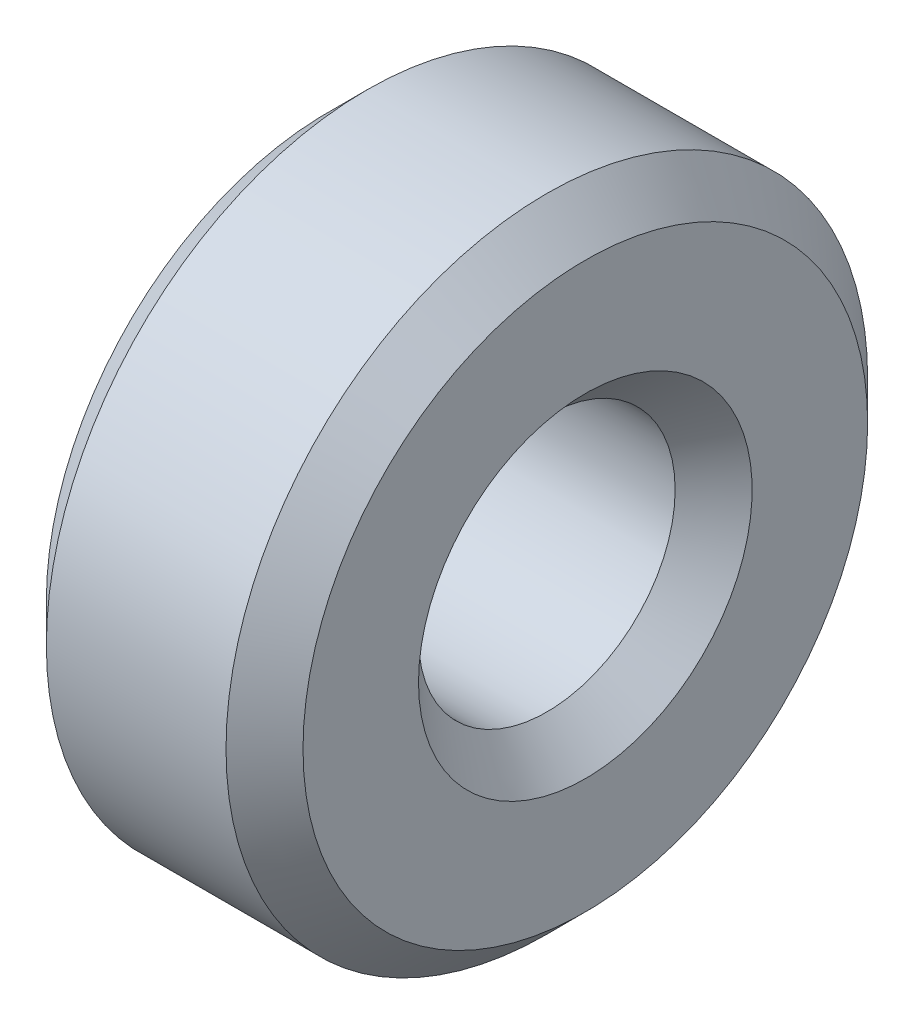
ISO-10303-21;
HEADER;
FILE_DESCRIPTION(('STEP AP214'),'2;1');
FILE_NAME('part.step','',(''),(''),'','','');
FILE_SCHEMA(('AUTOMOTIVE_DESIGN { 1 0 10303 214 1 1 1 1 }'));
ENDSEC;
DATA;
#1=APPLICATION_CONTEXT('core data for automotive mechanical design processes');
#2=APPLICATION_PROTOCOL_DEFINITION('international standard','automotive_design',2000,#1);
#3=PRODUCT_CONTEXT('',#1,'mechanical');
#4=PRODUCT('Part','Part','',(#3));
#5=PRODUCT_RELATED_PRODUCT_CATEGORY('part','',(#4));
#6=PRODUCT_DEFINITION_FORMATION('','',#4);
#7=PRODUCT_DEFINITION_CONTEXT('part definition',#1,'design');
#8=PRODUCT_DEFINITION('design','',#6,#7);
#9=PRODUCT_DEFINITION_SHAPE('','',#8);
#10=(LENGTH_UNIT() NAMED_UNIT(*) SI_UNIT(.MILLI.,.METRE.));
#11=(NAMED_UNIT(*) PLANE_ANGLE_UNIT() SI_UNIT($,.RADIAN.));
#12=(NAMED_UNIT(*) SI_UNIT($,.STERADIAN.) SOLID_ANGLE_UNIT());
#13=UNCERTAINTY_MEASURE_WITH_UNIT(LENGTH_MEASURE(1.E-05),#10,'distance_accuracy_value','');
#14=(GEOMETRIC_REPRESENTATION_CONTEXT(3) GLOBAL_UNCERTAINTY_ASSIGNED_CONTEXT((#13)) GLOBAL_UNIT_ASSIGNED_CONTEXT((#10,
#11,#12)) REPRESENTATION_CONTEXT('',''));
#15=CARTESIAN_POINT('',(0.,0.,0.));
#16=DIRECTION('',(0.,0.,1.));
#17=DIRECTION('',(1.,0.,0.));
#18=AXIS2_PLACEMENT_3D('',#15,#16,#17);
#19=CARTESIAN_POINT('',(0.,0.,0.));
#20=DIRECTION('',(-1.,0.,0.));
#21=DIRECTION('',(0.,0.,1.));
#22=AXIS2_PLACEMENT_3D('',#19,#20,#21);
#23=CYLINDRICAL_SURFACE('',#22,2.5);
#24=CARTESIAN_POINT('',(0.3,0.,0.));
#25=DIRECTION('',(1.,0.,0.));
#26=DIRECTION('',(0.,0.,-1.));
#27=AXIS2_PLACEMENT_3D('',#24,#25,#26);
#28=CIRCLE('',#27,2.5);
#29=CARTESIAN_POINT('',(0.3,0.,-2.5));
#30=VERTEX_POINT('',#29);
#31=EDGE_CURVE('E37',#30,#30,#28,.T.);
#32=ORIENTED_EDGE('',*,*,#31,.T.);
#33=EDGE_LOOP('',(#32));
#34=FACE_BOUND('',#33,.T.);
#35=CARTESIAN_POINT('',(1.7,0.,0.));
#36=DIRECTION('',(-1.,0.,0.));
#37=DIRECTION('',(0.,0.,1.));
#38=AXIS2_PLACEMENT_3D('',#35,#36,#37);
#39=CIRCLE('',#38,2.5);
#40=CARTESIAN_POINT('',(1.7,0.,2.5));
#41=VERTEX_POINT('',#40);
#42=EDGE_CURVE('E41',#41,#41,#39,.T.);
#43=ORIENTED_EDGE('',*,*,#42,.T.);
#44=EDGE_LOOP('',(#43));
#45=FACE_BOUND('',#44,.T.);
#46=ADVANCED_FACE('F27',(#34,#45),#23,.T.);
#47=CARTESIAN_POINT('',(2.,2.5,0.));
#48=DIRECTION('',(-1.,0.,0.));
#49=DIRECTION('',(0.,0.,1.));
#50=AXIS2_PLACEMENT_3D('',#47,#48,#49);
#51=PLANE('',#50);
#52=CARTESIAN_POINT('',(2.,0.,0.));
#53=DIRECTION('',(-1.,0.,0.));
#54=DIRECTION('',(0.,0.,1.));
#55=AXIS2_PLACEMENT_3D('',#52,#53,#54);
#56=CIRCLE('',#55,1.3);
#57=CARTESIAN_POINT('',(2.,0.,1.3));
#58=VERTEX_POINT('',#57);
#59=EDGE_CURVE('E10',#58,#58,#56,.T.);
#60=ORIENTED_EDGE('',*,*,#59,.T.);
#61=EDGE_LOOP('',(#60));
#62=FACE_BOUND('',#61,.T.);
#63=CARTESIAN_POINT('',(2.,0.,0.));
#64=DIRECTION('',(-1.,0.,0.));
#65=DIRECTION('',(0.,0.,1.));
#66=AXIS2_PLACEMENT_3D('',#63,#64,#65);
#67=CIRCLE('',#66,2.2);
#68=CARTESIAN_POINT('',(2.,0.,2.2));
#69=VERTEX_POINT('',#68);
#70=EDGE_CURVE('E33',#69,#69,#67,.F.);
#71=ORIENTED_EDGE('',*,*,#70,.T.);
#72=EDGE_LOOP('',(#71));
#73=FACE_BOUND('',#72,.T.);
#74=ADVANCED_FACE('F77',(#62,#73),#51,.F.);
#75=CARTESIAN_POINT('',(0.,0.,0.));
#76=DIRECTION('',(-1.,0.,0.));
#77=DIRECTION('',(0.,0.,1.));
#78=AXIS2_PLACEMENT_3D('',#75,#76,#77);
#79=CYLINDRICAL_SURFACE('',#78,1.);
#80=CARTESIAN_POINT('',(0.299999999999998,0.,0.));
#81=DIRECTION('',(1.,0.,0.));
#82=DIRECTION('',(0.,0.,-1.));
#83=AXIS2_PLACEMENT_3D('',#80,#81,#82);
#84=CIRCLE('',#83,1.);
#85=CARTESIAN_POINT('',(0.299999999999998,0.,-1.));
#86=VERTEX_POINT('',#85);
#87=EDGE_CURVE('E52',#86,#86,#84,.F.);
#88=ORIENTED_EDGE('',*,*,#87,.T.);
#89=EDGE_LOOP('',(#88));
#90=FACE_BOUND('',#89,.T.);
#91=CARTESIAN_POINT('',(1.7,0.,0.));
#92=DIRECTION('',(-1.,0.,0.));
#93=DIRECTION('',(0.,0.,1.));
#94=AXIS2_PLACEMENT_3D('',#91,#92,#93);
#95=CIRCLE('',#94,1.);
#96=CARTESIAN_POINT('',(1.7,0.,1.));
#97=VERTEX_POINT('',#96);
#98=EDGE_CURVE('E55',#97,#97,#95,.F.);
#99=ORIENTED_EDGE('',*,*,#98,.T.);
#100=EDGE_LOOP('',(#99));
#101=FACE_BOUND('',#100,.T.);
#102=ADVANCED_FACE('F59',(#90,#101),#79,.F.);
#103=CARTESIAN_POINT('',(0.,1.,0.));
#104=DIRECTION('',(1.,0.,0.));
#105=DIRECTION('',(0.,0.,-1.));
#106=AXIS2_PLACEMENT_3D('',#103,#104,#105);
#107=PLANE('',#106);
#108=CARTESIAN_POINT('',(0.,0.,0.));
#109=DIRECTION('',(1.,0.,0.));
#110=DIRECTION('',(0.,0.,-1.));
#111=AXIS2_PLACEMENT_3D('',#108,#109,#110);
#112=CIRCLE('',#111,1.3);
#113=CARTESIAN_POINT('',(0.,0.,-1.3));
#114=VERTEX_POINT('',#113);
#115=EDGE_CURVE('E46',#114,#114,#112,.T.);
#116=ORIENTED_EDGE('',*,*,#115,.T.);
#117=EDGE_LOOP('',(#116));
#118=FACE_BOUND('',#117,.T.);
#119=CARTESIAN_POINT('',(0.,0.,0.));
#120=DIRECTION('',(1.,0.,0.));
#121=DIRECTION('',(0.,0.,-1.));
#122=AXIS2_PLACEMENT_3D('',#119,#120,#121);
#123=CIRCLE('',#122,2.2);
#124=CARTESIAN_POINT('',(0.,0.,-2.2));
#125=VERTEX_POINT('',#124);
#126=EDGE_CURVE('E49',#125,#125,#123,.F.);
#127=ORIENTED_EDGE('',*,*,#126,.T.);
#128=EDGE_LOOP('',(#127));
#129=FACE_BOUND('',#128,.T.);
#130=ADVANCED_FACE('F89',(#118,#129),#107,.F.);
#131=CARTESIAN_POINT('',(0.299999999999998,0.,0.));
#132=DIRECTION('',(-1.,0.,0.));
#133=DIRECTION('',(0.,0.,1.));
#134=AXIS2_PLACEMENT_3D('',#131,#132,#133);
#135=CONICAL_SURFACE('',#134,1.,0.78539816339745);
#136=ORIENTED_EDGE('',*,*,#115,.F.);
#137=EDGE_LOOP('',(#136));
#138=FACE_BOUND('',#137,.T.);
#139=ORIENTED_EDGE('',*,*,#87,.F.);
#140=EDGE_LOOP('',(#139));
#141=FACE_BOUND('',#140,.T.);
#142=ADVANCED_FACE('F73',(#138,#141),#135,.F.);
#143=CARTESIAN_POINT('',(0.,0.,0.));
#144=DIRECTION('',(1.,0.,0.));
#145=DIRECTION('',(0.,0.,-1.));
#146=AXIS2_PLACEMENT_3D('',#143,#144,#145);
#147=CONICAL_SURFACE('',#146,2.2,0.78539816339745);
#148=ORIENTED_EDGE('',*,*,#31,.F.);
#149=EDGE_LOOP('',(#148));
#150=FACE_BOUND('',#149,.T.);
#151=ORIENTED_EDGE('',*,*,#126,.F.);
#152=EDGE_LOOP('',(#151));
#153=FACE_BOUND('',#152,.T.);
#154=ADVANCED_FACE('F65',(#150,#153),#147,.T.);
#155=CARTESIAN_POINT('',(2.,0.,0.));
#156=DIRECTION('',(1.,0.,0.));
#157=DIRECTION('',(0.,0.,-1.));
#158=AXIS2_PLACEMENT_3D('',#155,#156,#157);
#159=CONICAL_SURFACE('',#158,1.3,0.785398163397446);
#160=ORIENTED_EDGE('',*,*,#98,.F.);
#161=EDGE_LOOP('',(#160));
#162=FACE_BOUND('',#161,.T.);
#163=ORIENTED_EDGE('',*,*,#59,.F.);
#164=EDGE_LOOP('',(#163));
#165=FACE_BOUND('',#164,.T.);
#166=ADVANCED_FACE('F61',(#162,#165),#159,.F.);
#167=CARTESIAN_POINT('',(1.7,0.,0.));
#168=DIRECTION('',(-1.,0.,0.));
#169=DIRECTION('',(0.,0.,1.));
#170=AXIS2_PLACEMENT_3D('',#167,#168,#169);
#171=CONICAL_SURFACE('',#170,2.5,0.785398163397447);
#172=CARTESIAN_POINT('',(2.,0.,2.2));
#173=CARTESIAN_POINT('',(1.996875,0.,2.203125));
#174=CARTESIAN_POINT('',(1.99375,0.,2.20625));
#175=CARTESIAN_POINT('',(1.9875,0.,2.2125));
#176=CARTESIAN_POINT('',(1.984375,0.,2.215625));
#177=CARTESIAN_POINT('',(1.978125,0.,2.221875));
#178=CARTESIAN_POINT('',(1.975,0.,2.225));
#179=CARTESIAN_POINT('',(1.96875,0.,2.23125));
#180=CARTESIAN_POINT('',(1.965625,0.,2.234375));
#181=CARTESIAN_POINT('',(1.959375,0.,2.240625));
#182=CARTESIAN_POINT('',(1.95625,0.,2.24375));
#183=CARTESIAN_POINT('',(1.95,0.,2.25));
#184=CARTESIAN_POINT('',(1.946875,0.,2.253125));
#185=CARTESIAN_POINT('',(1.940625,0.,2.259375));
#186=CARTESIAN_POINT('',(1.9375,0.,2.2625));
#187=CARTESIAN_POINT('',(1.93125,0.,2.26875));
#188=CARTESIAN_POINT('',(1.928125,0.,2.271875));
#189=CARTESIAN_POINT('',(1.921875,0.,2.278125));
#190=CARTESIAN_POINT('',(1.91875,0.,2.28125));
#191=CARTESIAN_POINT('',(1.9125,0.,2.2875));
#192=CARTESIAN_POINT('',(1.909375,0.,2.290625));
#193=CARTESIAN_POINT('',(1.903125,0.,2.296875));
#194=CARTESIAN_POINT('',(1.9,0.,2.3));
#195=CARTESIAN_POINT('',(1.89375,0.,2.30625));
#196=CARTESIAN_POINT('',(1.890625,0.,2.309375));
#197=CARTESIAN_POINT('',(1.884375,0.,2.315625));
#198=CARTESIAN_POINT('',(1.88125,0.,2.31875));
#199=CARTESIAN_POINT('',(1.875,0.,2.325));
#200=CARTESIAN_POINT('',(1.871875,0.,2.328125));
#201=CARTESIAN_POINT('',(1.865625,0.,2.334375));
#202=CARTESIAN_POINT('',(1.8625,0.,2.3375));
#203=CARTESIAN_POINT('',(1.85625,0.,2.34375));
#204=CARTESIAN_POINT('',(1.853125,0.,2.346875));
#205=CARTESIAN_POINT('',(1.846875,0.,2.353125));
#206=CARTESIAN_POINT('',(1.84375,0.,2.35625));
#207=CARTESIAN_POINT('',(1.8375,0.,2.3625));
#208=CARTESIAN_POINT('',(1.834375,0.,2.365625));
#209=CARTESIAN_POINT('',(1.828125,0.,2.371875));
#210=CARTESIAN_POINT('',(1.825,0.,2.375));
#211=CARTESIAN_POINT('',(1.81875,0.,2.38125));
#212=CARTESIAN_POINT('',(1.815625,0.,2.384375));
#213=CARTESIAN_POINT('',(1.809375,0.,2.390625));
#214=CARTESIAN_POINT('',(1.80625,0.,2.39375));
#215=CARTESIAN_POINT('',(1.8,0.,2.4));
#216=CARTESIAN_POINT('',(1.796875,0.,2.403125));
#217=CARTESIAN_POINT('',(1.790625,0.,2.409375));
#218=CARTESIAN_POINT('',(1.7875,0.,2.4125));
#219=CARTESIAN_POINT('',(1.78125,0.,2.41875));
#220=CARTESIAN_POINT('',(1.778125,0.,2.421875));
#221=CARTESIAN_POINT('',(1.771875,0.,2.428125));
#222=CARTESIAN_POINT('',(1.76875,0.,2.43125));
#223=CARTESIAN_POINT('',(1.7625,0.,2.4375));
#224=CARTESIAN_POINT('',(1.759375,0.,2.440625));
#225=CARTESIAN_POINT('',(1.753125,0.,2.446875));
#226=CARTESIAN_POINT('',(1.75,0.,2.45));
#227=CARTESIAN_POINT('',(1.74375,0.,2.45625));
#228=CARTESIAN_POINT('',(1.740625,0.,2.459375));
#229=CARTESIAN_POINT('',(1.734375,0.,2.465625));
#230=CARTESIAN_POINT('',(1.73125,0.,2.46875));
#231=CARTESIAN_POINT('',(1.725,0.,2.475));
#232=CARTESIAN_POINT('',(1.721875,0.,2.478125));
#233=CARTESIAN_POINT('',(1.715625,0.,2.484375));
#234=CARTESIAN_POINT('',(1.7125,0.,2.4875));
#235=CARTESIAN_POINT('',(1.70625,0.,2.49375));
#236=CARTESIAN_POINT('',(1.703125,0.,2.496875));
#237=CARTESIAN_POINT('',(1.7,0.,2.5));
#238=B_SPLINE_CURVE_WITH_KNOTS('',3,(#172,#173,#174,#175,#176,#177,#178,#179,#180,#181,#182,
#183,#184,#185,#186,#187,#188,#189,#190,#191,#192,#193,#194,#195,#196,#197,#198,#199,#200,#201,
#202,#203,#204,#205,#206,#207,#208,#209,#210,#211,#212,#213,#214,#215,#216,#217,#218,#219,#220,
#221,#222,#223,#224,#225,#226,#227,#228,#229,#230,#231,#232,#233,#234,#235,#236,#237),
.UNSPECIFIED.,.F.,.F.,(4,2,2,2,2,2,2,2,2,2,2,2,2,2,2,2,2,2,2,2,2,2,2,2,2,2,2,2,2,2,2,2,4),(0.,
0.0132582521472481,0.0265165042944957,0.0397747564417435,0.0530330085889914,0.0662912607362392,
0.079549512883487,0.0928077650307347,0.106066017177982,0.11932426932523,0.132582521472478,
0.145840773619726,0.159099025766974,0.172357277914221,0.185615530061469,0.198873782208717,
0.212132034355965,0.225390286503213,0.23864853865046,0.251906790797708,0.265165042944956,
0.278423295092204,0.291681547239452,0.304939799386699,0.318198051533947,0.331456303681195,
0.344714555828443,0.357972807975691,0.371231060122938,0.384489312270186,0.397747564417434,
0.411005816564682,0.42426406871193),.UNSPECIFIED.);
#239=EDGE_CURVE('BSEAM64',#69,#41,#238,.T.);
#240=ORIENTED_EDGE('',*,*,#70,.F.);
#241=ORIENTED_EDGE('',*,*,#42,.F.);
#242=ORIENTED_EDGE('',*,*,#239,.T.);
#243=ORIENTED_EDGE('',*,*,#239,.F.);
#244=EDGE_LOOP('',(#240,#242,#241,#243));
#245=FACE_BOUND('',#244,.T.);
#246=ADVANCED_FACE('F64',(#245),#171,.T.);
#247=CLOSED_SHELL('',(#46,#74,#102,#130,#142,#154,#166,#246));
#248=MANIFOLD_SOLID_BREP('B2',#247);
#249=ADVANCED_BREP_SHAPE_REPRESENTATION('',(#18,#248),#14);
#250=SHAPE_DEFINITION_REPRESENTATION(#9,#249);
ENDSEC;
END-ISO-10303-21;
